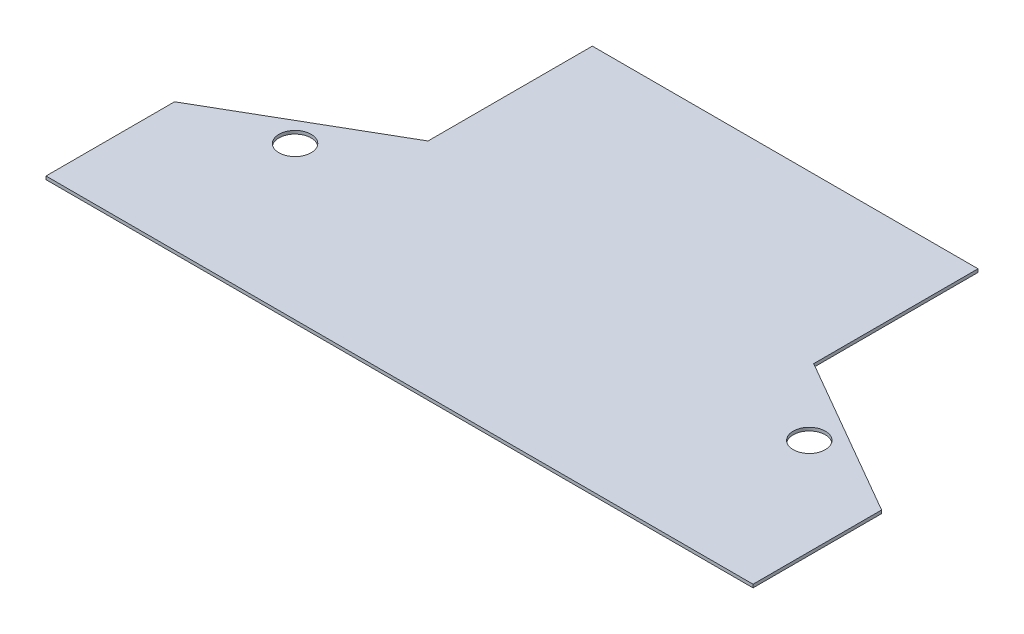
ISO-10303-21;
HEADER;
FILE_DESCRIPTION(('STEP AP214'),'2;1');
FILE_NAME('part.step','',(''),(''),'','','');
FILE_SCHEMA(('AUTOMOTIVE_DESIGN { 1 0 10303 214 1 1 1 1 }'));
ENDSEC;
DATA;
#1=APPLICATION_CONTEXT('core data for automotive mechanical design processes');
#2=APPLICATION_PROTOCOL_DEFINITION('international standard','automotive_design',2000,#1);
#3=PRODUCT_CONTEXT('',#1,'mechanical');
#4=PRODUCT('Part','Part','',(#3));
#5=PRODUCT_RELATED_PRODUCT_CATEGORY('part','',(#4));
#6=PRODUCT_DEFINITION_FORMATION('','',#4);
#7=PRODUCT_DEFINITION_CONTEXT('part definition',#1,'design');
#8=PRODUCT_DEFINITION('design','',#6,#7);
#9=PRODUCT_DEFINITION_SHAPE('','',#8);
#10=(LENGTH_UNIT() NAMED_UNIT(*) SI_UNIT(.MILLI.,.METRE.));
#11=(NAMED_UNIT(*) PLANE_ANGLE_UNIT() SI_UNIT($,.RADIAN.));
#12=(NAMED_UNIT(*) SI_UNIT($,.STERADIAN.) SOLID_ANGLE_UNIT());
#13=UNCERTAINTY_MEASURE_WITH_UNIT(LENGTH_MEASURE(1.E-05),#10,'distance_accuracy_value','');
#14=(GEOMETRIC_REPRESENTATION_CONTEXT(3) GLOBAL_UNCERTAINTY_ASSIGNED_CONTEXT((#13)) GLOBAL_UNIT_ASSIGNED_CONTEXT((#10,
#11,#12)) REPRESENTATION_CONTEXT('',''));
#15=CARTESIAN_POINT('',(0.,0.,0.));
#16=DIRECTION('',(0.,0.,1.));
#17=DIRECTION('',(1.,0.,0.));
#18=AXIS2_PLACEMENT_3D('',#15,#16,#17);
#19=CARTESIAN_POINT('',(0.,0.1,0.));
#20=DIRECTION('',(0.,-1.,0.));
#21=DIRECTION('',(0.,0.,-1.));
#22=AXIS2_PLACEMENT_3D('',#19,#20,#21);
#23=PLANE('',#22);
#24=DIRECTION('',(0.,0.,-1.));
#25=VECTOR('',#24,1.);
#26=CARTESIAN_POINT('',(0.,0.1,0.));
#27=LINE('',#26,#25);
#28=CARTESIAN_POINT('',(0.,0.1,0.));
#29=VERTEX_POINT('',#28);
#30=CARTESIAN_POINT('',(0.,0.1,-4.));
#31=VERTEX_POINT('',#30);
#32=EDGE_CURVE('E144',#29,#31,#27,.T.);
#33=ORIENTED_EDGE('',*,*,#32,.T.);
#34=DIRECTION('',(-0.866006754529784,0.,-0.500032300065497));
#35=VECTOR('',#34,1.);
#36=CARTESIAN_POINT('',(0.,0.1,-4.));
#37=LINE('',#36,#35);
#38=CARTESIAN_POINT('',(-5.,0.1,-6.887));
#39=VERTEX_POINT('',#38);
#40=EDGE_CURVE('E92',#31,#39,#37,.T.);
#41=ORIENTED_EDGE('',*,*,#40,.T.);
#42=DIRECTION('',(0.,0.,-1.));
#43=VECTOR('',#42,1.);
#44=CARTESIAN_POINT('',(-5.,0.1,-6.887));
#45=LINE('',#44,#43);
#46=CARTESIAN_POINT('',(-5.,0.1,-12.));
#47=VERTEX_POINT('',#46);
#48=EDGE_CURVE('E159',#39,#47,#45,.T.);
#49=ORIENTED_EDGE('',*,*,#48,.T.);
#50=DIRECTION('',(-1.,0.,0.));
#51=VECTOR('',#50,1.);
#52=CARTESIAN_POINT('',(-17.,0.1,-12.));
#53=LINE('',#52,#51);
#54=CARTESIAN_POINT('',(-17.,0.1,-12.));
#55=VERTEX_POINT('',#54);
#56=EDGE_CURVE('E172',#47,#55,#53,.T.);
#57=ORIENTED_EDGE('',*,*,#56,.T.);
#58=DIRECTION('',(0.,0.,1.));
#59=VECTOR('',#58,1.);
#60=CARTESIAN_POINT('',(-17.,0.1,-6.887));
#61=LINE('',#60,#59);
#62=CARTESIAN_POINT('',(-17.,0.1,-6.887));
#63=VERTEX_POINT('',#62);
#64=EDGE_CURVE('E111',#55,#63,#61,.T.);
#65=ORIENTED_EDGE('',*,*,#64,.T.);
#66=DIRECTION('',(-0.866006754529784,0.,0.500032300065497));
#67=VECTOR('',#66,1.);
#68=CARTESIAN_POINT('',(-22.,0.1,-4.));
#69=LINE('',#68,#67);
#70=CARTESIAN_POINT('',(-22.,0.1,-4.));
#71=VERTEX_POINT('',#70);
#72=EDGE_CURVE('E105',#63,#71,#69,.T.);
#73=ORIENTED_EDGE('',*,*,#72,.T.);
#74=DIRECTION('',(0.,0.,1.));
#75=VECTOR('',#74,1.);
#76=CARTESIAN_POINT('',(-22.,0.1,0.));
#77=LINE('',#76,#75);
#78=CARTESIAN_POINT('',(-22.,0.1,0.));
#79=VERTEX_POINT('',#78);
#80=EDGE_CURVE('E109',#71,#79,#77,.T.);
#81=ORIENTED_EDGE('',*,*,#80,.T.);
#82=DIRECTION('',(1.,0.,0.));
#83=VECTOR('',#82,1.);
#84=CARTESIAN_POINT('',(0.,0.1,0.));
#85=LINE('',#84,#83);
#86=EDGE_CURVE('E49',#79,#29,#85,.T.);
#87=ORIENTED_EDGE('',*,*,#86,.T.);
#88=EDGE_LOOP('',(#33,#41,#49,#57,#65,#73,#81,#87));
#89=FACE_BOUND('',#88,.T.);
#90=CARTESIAN_POINT('',(-19.,0.1,-4.75));
#91=DIRECTION('',(0.,1.,0.));
#92=DIRECTION('',(0.,0.,1.));
#93=AXIS2_PLACEMENT_3D('',#90,#91,#92);
#94=CIRCLE('',#93,0.499999999999999);
#95=CARTESIAN_POINT('',(-19.,0.1,-4.25));
#96=VERTEX_POINT('',#95);
#97=EDGE_CURVE('E133',#96,#96,#94,.T.);
#98=ORIENTED_EDGE('',*,*,#97,.F.);
#99=EDGE_LOOP('',(#98));
#100=FACE_BOUND('',#99,.T.);
#101=CARTESIAN_POINT('',(-3.,0.1,-4.75));
#102=DIRECTION('',(0.,1.,0.));
#103=DIRECTION('',(0.,0.,1.));
#104=AXIS2_PLACEMENT_3D('',#101,#102,#103);
#105=CIRCLE('',#104,0.499999999999999);
#106=CARTESIAN_POINT('',(-3.,0.1,-4.25));
#107=VERTEX_POINT('',#106);
#108=EDGE_CURVE('E181',#107,#107,#105,.T.);
#109=ORIENTED_EDGE('',*,*,#108,.F.);
#110=EDGE_LOOP('',(#109));
#111=FACE_BOUND('',#110,.T.);
#112=ADVANCED_FACE('F32',(#89,#100,#111),#23,.F.);
#113=CARTESIAN_POINT('',(0.,0.,0.));
#114=DIRECTION('',(0.,-1.,0.));
#115=DIRECTION('',(0.,0.,-1.));
#116=AXIS2_PLACEMENT_3D('',#113,#114,#115);
#117=PLANE('',#116);
#118=CARTESIAN_POINT('',(-19.,0.,-4.75));
#119=DIRECTION('',(0.,1.,0.));
#120=DIRECTION('',(0.,0.,1.));
#121=AXIS2_PLACEMENT_3D('',#118,#119,#120);
#122=CIRCLE('',#121,0.499999999999999);
#123=CARTESIAN_POINT('',(-19.,0.,-4.25));
#124=VERTEX_POINT('',#123);
#125=EDGE_CURVE('E178',#124,#124,#122,.T.);
#126=ORIENTED_EDGE('',*,*,#125,.T.);
#127=EDGE_LOOP('',(#126));
#128=FACE_BOUND('',#127,.T.);
#129=DIRECTION('',(0.,0.,-1.));
#130=VECTOR('',#129,1.);
#131=CARTESIAN_POINT('',(0.,0.,0.));
#132=LINE('',#131,#130);
#133=CARTESIAN_POINT('',(0.,0.,0.));
#134=VERTEX_POINT('',#133);
#135=CARTESIAN_POINT('',(0.,0.,-4.));
#136=VERTEX_POINT('',#135);
#137=EDGE_CURVE('E129',#134,#136,#132,.T.);
#138=ORIENTED_EDGE('',*,*,#137,.F.);
#139=DIRECTION('',(1.,0.,0.));
#140=VECTOR('',#139,1.);
#141=CARTESIAN_POINT('',(0.,0.,0.));
#142=LINE('',#141,#140);
#143=CARTESIAN_POINT('',(-22.,0.,0.));
#144=VERTEX_POINT('',#143);
#145=EDGE_CURVE('E84',#144,#134,#142,.T.);
#146=ORIENTED_EDGE('',*,*,#145,.F.);
#147=DIRECTION('',(0.,0.,1.));
#148=VECTOR('',#147,1.);
#149=CARTESIAN_POINT('',(-22.,0.,0.));
#150=LINE('',#149,#148);
#151=CARTESIAN_POINT('',(-22.,0.,-4.));
#152=VERTEX_POINT('',#151);
#153=EDGE_CURVE('E78',#152,#144,#150,.T.);
#154=ORIENTED_EDGE('',*,*,#153,.F.);
#155=DIRECTION('',(-0.866006754529784,0.,0.500032300065497));
#156=VECTOR('',#155,1.);
#157=CARTESIAN_POINT('',(-22.,0.,-4.));
#158=LINE('',#157,#156);
#159=CARTESIAN_POINT('',(-17.,0.,-6.887));
#160=VERTEX_POINT('',#159);
#161=EDGE_CURVE('E119',#160,#152,#158,.T.);
#162=ORIENTED_EDGE('',*,*,#161,.F.);
#163=DIRECTION('',(0.,0.,1.));
#164=VECTOR('',#163,1.);
#165=CARTESIAN_POINT('',(-17.,0.,-6.887));
#166=LINE('',#165,#164);
#167=CARTESIAN_POINT('',(-17.,0.,-12.));
#168=VERTEX_POINT('',#167);
#169=EDGE_CURVE('E139',#168,#160,#166,.T.);
#170=ORIENTED_EDGE('',*,*,#169,.F.);
#171=DIRECTION('',(-1.,0.,0.));
#172=VECTOR('',#171,1.);
#173=CARTESIAN_POINT('',(-17.,0.,-12.));
#174=LINE('',#173,#172);
#175=CARTESIAN_POINT('',(-5.,0.,-12.));
#176=VERTEX_POINT('',#175);
#177=EDGE_CURVE('E137',#176,#168,#174,.T.);
#178=ORIENTED_EDGE('',*,*,#177,.F.);
#179=DIRECTION('',(0.,0.,-1.));
#180=VECTOR('',#179,1.);
#181=CARTESIAN_POINT('',(-5.,0.,-6.887));
#182=LINE('',#181,#180);
#183=CARTESIAN_POINT('',(-5.,0.,-6.887));
#184=VERTEX_POINT('',#183);
#185=EDGE_CURVE('E135',#184,#176,#182,.T.);
#186=ORIENTED_EDGE('',*,*,#185,.F.);
#187=DIRECTION('',(-0.866006754529784,0.,-0.500032300065497));
#188=VECTOR('',#187,1.);
#189=CARTESIAN_POINT('',(0.,0.,-4.));
#190=LINE('',#189,#188);
#191=EDGE_CURVE('E132',#136,#184,#190,.T.);
#192=ORIENTED_EDGE('',*,*,#191,.F.);
#193=EDGE_LOOP('',(#138,#146,#154,#162,#170,#178,#186,#192));
#194=FACE_BOUND('',#193,.T.);
#195=CARTESIAN_POINT('',(-3.,0.,-4.75));
#196=DIRECTION('',(0.,1.,0.));
#197=DIRECTION('',(0.,0.,1.));
#198=AXIS2_PLACEMENT_3D('',#195,#196,#197);
#199=CIRCLE('',#198,0.499999999999999);
#200=CARTESIAN_POINT('',(-3.,0.,-4.25));
#201=VERTEX_POINT('',#200);
#202=EDGE_CURVE('E184',#201,#201,#199,.T.);
#203=ORIENTED_EDGE('',*,*,#202,.T.);
#204=EDGE_LOOP('',(#203));
#205=FACE_BOUND('',#204,.T.);
#206=ADVANCED_FACE('F163',(#128,#194,#205),#117,.T.);
#207=CARTESIAN_POINT('',(0.,0.1,0.));
#208=DIRECTION('',(-1.,0.,0.));
#209=DIRECTION('',(0.,0.,1.));
#210=AXIS2_PLACEMENT_3D('',#207,#208,#209);
#211=PLANE('',#210);
#212=ORIENTED_EDGE('',*,*,#137,.T.);
#213=DIRECTION('',(0.,-1.,0.));
#214=VECTOR('',#213,1.);
#215=CARTESIAN_POINT('',(0.,0.1,-4.));
#216=LINE('',#215,#214);
#217=EDGE_CURVE('E11',#31,#136,#216,.T.);
#218=ORIENTED_EDGE('',*,*,#217,.F.);
#219=ORIENTED_EDGE('',*,*,#32,.F.);
#220=DIRECTION('',(0.,-1.,0.));
#221=VECTOR('',#220,1.);
#222=CARTESIAN_POINT('',(0.,0.1,0.));
#223=LINE('',#222,#221);
#224=EDGE_CURVE('E125',#29,#134,#223,.T.);
#225=ORIENTED_EDGE('',*,*,#224,.T.);
#226=EDGE_LOOP('',(#212,#218,#219,#225));
#227=FACE_BOUND('',#226,.T.);
#228=ADVANCED_FACE('F34',(#227),#211,.F.);
#229=CARTESIAN_POINT('',(0.,0.1,-4.));
#230=DIRECTION('',(-0.500032300065497,0.,0.866006754529784));
#231=DIRECTION('',(0.866006754529784,0.,0.500032300065497));
#232=AXIS2_PLACEMENT_3D('',#229,#230,#231);
#233=PLANE('',#232);
#234=ORIENTED_EDGE('',*,*,#191,.T.);
#235=DIRECTION('',(0.,-1.,0.));
#236=VECTOR('',#235,1.);
#237=CARTESIAN_POINT('',(-5.,0.1,-6.887));
#238=LINE('',#237,#236);
#239=EDGE_CURVE('E41',#39,#184,#238,.T.);
#240=ORIENTED_EDGE('',*,*,#239,.F.);
#241=ORIENTED_EDGE('',*,*,#40,.F.);
#242=ORIENTED_EDGE('',*,*,#217,.T.);
#243=EDGE_LOOP('',(#234,#240,#241,#242));
#244=FACE_BOUND('',#243,.T.);
#245=ADVANCED_FACE('F216',(#244),#233,.F.);
#246=CARTESIAN_POINT('',(-5.,0.1,-6.887));
#247=DIRECTION('',(-1.,0.,0.));
#248=DIRECTION('',(0.,0.,1.));
#249=AXIS2_PLACEMENT_3D('',#246,#247,#248);
#250=PLANE('',#249);
#251=ORIENTED_EDGE('',*,*,#185,.T.);
#252=DIRECTION('',(0.,-1.,0.));
#253=VECTOR('',#252,1.);
#254=CARTESIAN_POINT('',(-5.,0.1,-12.));
#255=LINE('',#254,#253);
#256=EDGE_CURVE('E151',#47,#176,#255,.T.);
#257=ORIENTED_EDGE('',*,*,#256,.F.);
#258=ORIENTED_EDGE('',*,*,#48,.F.);
#259=ORIENTED_EDGE('',*,*,#239,.T.);
#260=EDGE_LOOP('',(#251,#257,#258,#259));
#261=FACE_BOUND('',#260,.T.);
#262=ADVANCED_FACE('F157',(#261),#250,.F.);
#263=CARTESIAN_POINT('',(-17.,0.1,-12.));
#264=DIRECTION('',(0.,0.,1.));
#265=DIRECTION('',(1.,0.,0.));
#266=AXIS2_PLACEMENT_3D('',#263,#264,#265);
#267=PLANE('',#266);
#268=ORIENTED_EDGE('',*,*,#177,.T.);
#269=DIRECTION('',(0.,-1.,0.));
#270=VECTOR('',#269,1.);
#271=CARTESIAN_POINT('',(-17.,0.1,-12.));
#272=LINE('',#271,#270);
#273=EDGE_CURVE('E148',#55,#168,#272,.T.);
#274=ORIENTED_EDGE('',*,*,#273,.F.);
#275=ORIENTED_EDGE('',*,*,#56,.F.);
#276=ORIENTED_EDGE('',*,*,#256,.T.);
#277=EDGE_LOOP('',(#268,#274,#275,#276));
#278=FACE_BOUND('',#277,.T.);
#279=ADVANCED_FACE('F168',(#278),#267,.F.);
#280=CARTESIAN_POINT('',(-17.,0.1,-6.887));
#281=DIRECTION('',(1.,0.,0.));
#282=DIRECTION('',(0.,0.,-1.));
#283=AXIS2_PLACEMENT_3D('',#280,#281,#282);
#284=PLANE('',#283);
#285=ORIENTED_EDGE('',*,*,#169,.T.);
#286=DIRECTION('',(0.,-1.,0.));
#287=VECTOR('',#286,1.);
#288=CARTESIAN_POINT('',(-17.,0.1,-6.887));
#289=LINE('',#288,#287);
#290=EDGE_CURVE('E120',#63,#160,#289,.T.);
#291=ORIENTED_EDGE('',*,*,#290,.F.);
#292=ORIENTED_EDGE('',*,*,#64,.F.);
#293=ORIENTED_EDGE('',*,*,#273,.T.);
#294=EDGE_LOOP('',(#285,#291,#292,#293));
#295=FACE_BOUND('',#294,.T.);
#296=ADVANCED_FACE('F171',(#295),#284,.F.);
#297=CARTESIAN_POINT('',(-22.,0.1,-4.));
#298=DIRECTION('',(0.500032300065497,0.,0.866006754529784));
#299=DIRECTION('',(0.866006754529784,0.,-0.500032300065497));
#300=AXIS2_PLACEMENT_3D('',#297,#298,#299);
#301=PLANE('',#300);
#302=ORIENTED_EDGE('',*,*,#161,.T.);
#303=DIRECTION('',(0.,-1.,0.));
#304=VECTOR('',#303,1.);
#305=CARTESIAN_POINT('',(-22.,0.1,-4.));
#306=LINE('',#305,#304);
#307=EDGE_CURVE('E116',#71,#152,#306,.T.);
#308=ORIENTED_EDGE('',*,*,#307,.F.);
#309=ORIENTED_EDGE('',*,*,#72,.F.);
#310=ORIENTED_EDGE('',*,*,#290,.T.);
#311=EDGE_LOOP('',(#302,#308,#309,#310));
#312=FACE_BOUND('',#311,.T.);
#313=ADVANCED_FACE('F117',(#312),#301,.F.);
#314=CARTESIAN_POINT('',(-22.,0.1,0.));
#315=DIRECTION('',(1.,0.,0.));
#316=DIRECTION('',(0.,0.,-1.));
#317=AXIS2_PLACEMENT_3D('',#314,#315,#316);
#318=PLANE('',#317);
#319=ORIENTED_EDGE('',*,*,#153,.T.);
#320=DIRECTION('',(0.,-1.,0.));
#321=VECTOR('',#320,1.);
#322=CARTESIAN_POINT('',(-22.,0.1,0.));
#323=LINE('',#322,#321);
#324=EDGE_CURVE('E121',#79,#144,#323,.T.);
#325=ORIENTED_EDGE('',*,*,#324,.F.);
#326=ORIENTED_EDGE('',*,*,#80,.F.);
#327=ORIENTED_EDGE('',*,*,#307,.T.);
#328=EDGE_LOOP('',(#319,#325,#326,#327));
#329=FACE_BOUND('',#328,.T.);
#330=ADVANCED_FACE('F123',(#329),#318,.F.);
#331=CARTESIAN_POINT('',(0.,0.1,0.));
#332=DIRECTION('',(0.,0.,-1.));
#333=DIRECTION('',(-1.,0.,0.));
#334=AXIS2_PLACEMENT_3D('',#331,#332,#333);
#335=PLANE('',#334);
#336=ORIENTED_EDGE('',*,*,#145,.T.);
#337=ORIENTED_EDGE('',*,*,#224,.F.);
#338=ORIENTED_EDGE('',*,*,#86,.F.);
#339=ORIENTED_EDGE('',*,*,#324,.T.);
#340=EDGE_LOOP('',(#336,#337,#338,#339));
#341=FACE_BOUND('',#340,.T.);
#342=ADVANCED_FACE('F204',(#341),#335,.F.);
#343=CARTESIAN_POINT('',(-19.,0.1,-4.75));
#344=DIRECTION('',(0.,-1.,0.));
#345=DIRECTION('',(0.,0.,-1.));
#346=AXIS2_PLACEMENT_3D('',#343,#344,#345);
#347=CYLINDRICAL_SURFACE('',#346,0.499999999999999);
#348=ORIENTED_EDGE('',*,*,#97,.T.);
#349=EDGE_LOOP('',(#348));
#350=FACE_BOUND('',#349,.T.);
#351=ORIENTED_EDGE('',*,*,#125,.F.);
#352=EDGE_LOOP('',(#351));
#353=FACE_BOUND('',#352,.T.);
#354=ADVANCED_FACE('F201',(#350,#353),#347,.F.);
#355=CARTESIAN_POINT('',(-3.,0.1,-4.75));
#356=DIRECTION('',(0.,-1.,0.));
#357=DIRECTION('',(0.,0.,-1.));
#358=AXIS2_PLACEMENT_3D('',#355,#356,#357);
#359=CYLINDRICAL_SURFACE('',#358,0.499999999999999);
#360=ORIENTED_EDGE('',*,*,#108,.T.);
#361=EDGE_LOOP('',(#360));
#362=FACE_BOUND('',#361,.T.);
#363=ORIENTED_EDGE('',*,*,#202,.F.);
#364=EDGE_LOOP('',(#363));
#365=FACE_BOUND('',#364,.T.);
#366=ADVANCED_FACE('F190',(#362,#365),#359,.F.);
#367=CLOSED_SHELL('',(#112,#206,#228,#245,#262,#279,#296,#313,#330,#342,#354,#366));
#368=MANIFOLD_SOLID_BREP('B2',#367);
#369=ADVANCED_BREP_SHAPE_REPRESENTATION('',(#18,#368),#14);
#370=SHAPE_DEFINITION_REPRESENTATION(#9,#369);
ENDSEC;
END-ISO-10303-21;
